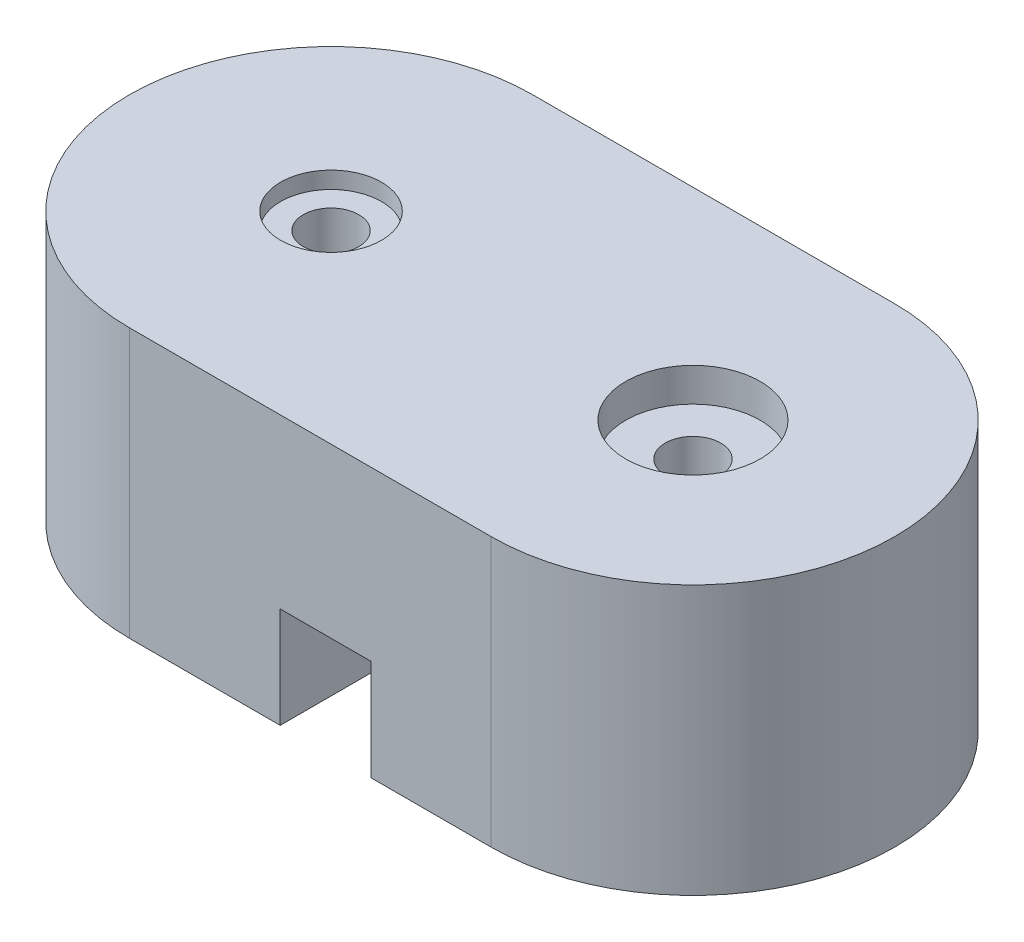
ISO-10303-21;
HEADER;
FILE_DESCRIPTION(('STEP AP214'),'2;1');
FILE_NAME('part.step','',(''),(''),'','','');
FILE_SCHEMA(('AUTOMOTIVE_DESIGN { 1 0 10303 214 1 1 1 1 }'));
ENDSEC;
DATA;
#1=APPLICATION_CONTEXT('core data for automotive mechanical design processes');
#2=APPLICATION_PROTOCOL_DEFINITION('international standard','automotive_design',2000,#1);
#3=PRODUCT_CONTEXT('',#1,'mechanical');
#4=PRODUCT('Part','Part','',(#3));
#5=PRODUCT_RELATED_PRODUCT_CATEGORY('part','',(#4));
#6=PRODUCT_DEFINITION_FORMATION('','',#4);
#7=PRODUCT_DEFINITION_CONTEXT('part definition',#1,'design');
#8=PRODUCT_DEFINITION('design','',#6,#7);
#9=PRODUCT_DEFINITION_SHAPE('','',#8);
#10=(LENGTH_UNIT() NAMED_UNIT(*) SI_UNIT(.MILLI.,.METRE.));
#11=(NAMED_UNIT(*) PLANE_ANGLE_UNIT() SI_UNIT($,.RADIAN.));
#12=(NAMED_UNIT(*) SI_UNIT($,.STERADIAN.) SOLID_ANGLE_UNIT());
#13=UNCERTAINTY_MEASURE_WITH_UNIT(LENGTH_MEASURE(1.E-05),#10,'distance_accuracy_value','');
#14=(GEOMETRIC_REPRESENTATION_CONTEXT(3) GLOBAL_UNCERTAINTY_ASSIGNED_CONTEXT((#13)) GLOBAL_UNIT_ASSIGNED_CONTEXT((#10,
#11,#12)) REPRESENTATION_CONTEXT('',''));
#15=CARTESIAN_POINT('',(0.,0.,0.));
#16=DIRECTION('',(0.,0.,1.));
#17=DIRECTION('',(1.,0.,0.));
#18=AXIS2_PLACEMENT_3D('',#15,#16,#17);
#19=CARTESIAN_POINT('',(-10.765,0.,0.));
#20=DIRECTION('',(0.,1.,0.));
#21=DIRECTION('',(0.,0.,1.));
#22=AXIS2_PLACEMENT_3D('',#19,#20,#21);
#23=CYLINDRICAL_SURFACE('',#22,1.65);
#24=CARTESIAN_POINT('',(-10.765,12.,0.));
#25=DIRECTION('',(0.,1.,0.));
#26=DIRECTION('',(0.,0.,1.));
#27=AXIS2_PLACEMENT_3D('',#24,#25,#26);
#28=CIRCLE('',#27,1.65);
#29=CARTESIAN_POINT('',(-10.765,12.,1.65));
#30=VERTEX_POINT('',#29);
#31=EDGE_CURVE('E175',#30,#30,#28,.T.);
#32=ORIENTED_EDGE('',*,*,#31,.T.);
#33=EDGE_LOOP('',(#32));
#34=FACE_BOUND('',#33,.T.);
#35=CARTESIAN_POINT('',(-10.765,8.3,0.));
#36=DIRECTION('',(0.,-1.,0.));
#37=DIRECTION('',(0.,0.,-1.));
#38=AXIS2_PLACEMENT_3D('',#35,#36,#37);
#39=CIRCLE('',#38,1.65);
#40=CARTESIAN_POINT('',(-10.765,8.3,-1.65));
#41=VERTEX_POINT('',#40);
#42=EDGE_CURVE('E43',#41,#41,#39,.F.);
#43=ORIENTED_EDGE('',*,*,#42,.F.);
#44=EDGE_LOOP('',(#43));
#45=FACE_BOUND('',#44,.T.);
#46=ADVANCED_FACE('F39',(#34,#45),#23,.F.);
#47=CARTESIAN_POINT('',(3.6,3.,-12.));
#48=DIRECTION('',(1.,0.,0.));
#49=DIRECTION('',(0.,0.,-1.));
#50=AXIS2_PLACEMENT_3D('',#47,#48,#49);
#51=PLANE('',#50);
#52=DIRECTION('',(0.,0.,1.));
#53=VECTOR('',#52,1.);
#54=CARTESIAN_POINT('',(3.6,3.,-12.));
#55=LINE('',#54,#53);
#56=CARTESIAN_POINT('',(3.6,3.,2.21647806215175));
#57=VERTEX_POINT('',#56);
#58=CARTESIAN_POINT('',(3.6,3.,12.));
#59=VERTEX_POINT('',#58);
#60=EDGE_CURVE('E200',#57,#59,#55,.T.);
#61=ORIENTED_EDGE('',*,*,#60,.F.);
#62=DIRECTION('',(0.,-1.,0.));
#63=VECTOR('',#62,1.);
#64=CARTESIAN_POINT('',(3.6,6.3,2.21647806215175));
#65=LINE('',#64,#63);
#66=CARTESIAN_POINT('',(3.6,-3.,2.21647806215175));
#67=VERTEX_POINT('',#66);
#68=EDGE_CURVE('E54',#57,#67,#65,.T.);
#69=ORIENTED_EDGE('',*,*,#68,.T.);
#70=DIRECTION('',(0.,0.,-1.));
#71=VECTOR('',#70,1.);
#72=CARTESIAN_POINT('',(3.6,-3.,12.));
#73=LINE('',#72,#71);
#74=CARTESIAN_POINT('',(3.6,-3.,12.));
#75=VERTEX_POINT('',#74);
#76=EDGE_CURVE('E144',#75,#67,#73,.T.);
#77=ORIENTED_EDGE('',*,*,#76,.F.);
#78=DIRECTION('',(0.,-1.,0.));
#79=VECTOR('',#78,1.);
#80=CARTESIAN_POINT('',(3.6,3.,12.));
#81=LINE('',#80,#79);
#82=EDGE_CURVE('E141',#59,#75,#81,.T.);
#83=ORIENTED_EDGE('',*,*,#82,.F.);
#84=EDGE_LOOP('',(#61,#69,#77,#83));
#85=FACE_BOUND('',#84,.T.);
#86=ADVANCED_FACE('F228',(#85),#51,.F.);
#87=CARTESIAN_POINT('',(10.765,0.,0.));
#88=DIRECTION('',(0.,1.,0.));
#89=DIRECTION('',(0.,0.,1.));
#90=AXIS2_PLACEMENT_3D('',#87,#88,#89);
#91=CYLINDRICAL_SURFACE('',#90,1.65);
#92=CARTESIAN_POINT('',(10.765,11.,0.));
#93=DIRECTION('',(0.,1.,0.));
#94=DIRECTION('',(0.,0.,1.));
#95=AXIS2_PLACEMENT_3D('',#92,#93,#94);
#96=CIRCLE('',#95,1.65);
#97=CARTESIAN_POINT('',(10.765,11.,1.65));
#98=VERTEX_POINT('',#97);
#99=EDGE_CURVE('E182',#98,#98,#96,.T.);
#100=ORIENTED_EDGE('',*,*,#99,.T.);
#101=EDGE_LOOP('',(#100));
#102=FACE_BOUND('',#101,.T.);
#103=CARTESIAN_POINT('',(10.765,6.3,0.));
#104=DIRECTION('',(0.,-1.,0.));
#105=DIRECTION('',(0.,0.,-1.));
#106=AXIS2_PLACEMENT_3D('',#103,#104,#105);
#107=CIRCLE('',#106,1.65);
#108=CARTESIAN_POINT('',(10.765,6.3,-1.65));
#109=VERTEX_POINT('',#108);
#110=EDGE_CURVE('E170',#109,#109,#107,.F.);
#111=ORIENTED_EDGE('',*,*,#110,.F.);
#112=EDGE_LOOP('',(#111));
#113=FACE_BOUND('',#112,.T.);
#114=ADVANCED_FACE('F226',(#102,#113),#91,.F.);
#115=CARTESIAN_POINT('',(-10.765,13.,0.));
#116=DIRECTION('',(0.,-1.,0.));
#117=DIRECTION('',(0.,0.,-1.));
#118=AXIS2_PLACEMENT_3D('',#115,#116,#117);
#119=CYLINDRICAL_SURFACE('',#118,12.);
#120=DIRECTION('',(0.,-1.,0.));
#121=VECTOR('',#120,1.);
#122=CARTESIAN_POINT('',(-10.765,13.,-12.));
#123=LINE('',#122,#121);
#124=CARTESIAN_POINT('',(-10.765,13.,-12.));
#125=VERTEX_POINT('',#124);
#126=CARTESIAN_POINT('',(-10.765,-3.,-12.));
#127=VERTEX_POINT('',#126);
#128=EDGE_CURVE('E217',#125,#127,#123,.T.);
#129=ORIENTED_EDGE('',*,*,#128,.T.);
#130=CARTESIAN_POINT('',(-10.765,-3.,0.));
#131=DIRECTION('',(0.,-1.,0.));
#132=DIRECTION('',(0.,0.,-1.));
#133=AXIS2_PLACEMENT_3D('',#130,#131,#132);
#134=CIRCLE('',#133,12.);
#135=CARTESIAN_POINT('',(-10.765,-3.,12.));
#136=VERTEX_POINT('',#135);
#137=EDGE_CURVE('E147',#136,#127,#134,.T.);
#138=ORIENTED_EDGE('',*,*,#137,.F.);
#139=DIRECTION('',(0.,-1.,0.));
#140=VECTOR('',#139,1.);
#141=CARTESIAN_POINT('',(-10.765,13.,12.));
#142=LINE('',#141,#140);
#143=CARTESIAN_POINT('',(-10.765,13.,12.));
#144=VERTEX_POINT('',#143);
#145=EDGE_CURVE('E48',#144,#136,#142,.T.);
#146=ORIENTED_EDGE('',*,*,#145,.F.);
#147=CARTESIAN_POINT('',(-10.765,13.,0.));
#148=DIRECTION('',(0.,1.,0.));
#149=DIRECTION('',(0.,0.,1.));
#150=AXIS2_PLACEMENT_3D('',#147,#148,#149);
#151=CIRCLE('',#150,12.);
#152=EDGE_CURVE('E206',#125,#144,#151,.T.);
#153=ORIENTED_EDGE('',*,*,#152,.F.);
#154=EDGE_LOOP('',(#129,#138,#146,#153));
#155=FACE_BOUND('',#154,.T.);
#156=ADVANCED_FACE('F41',(#155),#119,.T.);
#157=CARTESIAN_POINT('',(-10.765,13.,12.));
#158=DIRECTION('',(0.,0.,-1.));
#159=DIRECTION('',(-1.,0.,0.));
#160=AXIS2_PLACEMENT_3D('',#157,#158,#159);
#161=PLANE('',#160);
#162=DIRECTION('',(-1.,0.,0.));
#163=VECTOR('',#162,1.);
#164=CARTESIAN_POINT('',(0.,3.,12.));
#165=LINE('',#164,#163);
#166=CARTESIAN_POINT('',(-1.79,3.,12.));
#167=VERTEX_POINT('',#166);
#168=EDGE_CURVE('E191',#59,#167,#165,.T.);
#169=ORIENTED_EDGE('',*,*,#168,.F.);
#170=ORIENTED_EDGE('',*,*,#82,.T.);
#171=DIRECTION('',(-1.,0.,0.));
#172=VECTOR('',#171,1.);
#173=CARTESIAN_POINT('',(10.765,-3.,12.));
#174=LINE('',#173,#172);
#175=CARTESIAN_POINT('',(10.765,-3.,12.));
#176=VERTEX_POINT('',#175);
#177=EDGE_CURVE('E133',#176,#75,#174,.T.);
#178=ORIENTED_EDGE('',*,*,#177,.F.);
#179=DIRECTION('',(0.,-1.,0.));
#180=VECTOR('',#179,1.);
#181=CARTESIAN_POINT('',(10.765,13.,12.));
#182=LINE('',#181,#180);
#183=CARTESIAN_POINT('',(10.765,13.,12.));
#184=VERTEX_POINT('',#183);
#185=EDGE_CURVE('E118',#184,#176,#182,.T.);
#186=ORIENTED_EDGE('',*,*,#185,.F.);
#187=DIRECTION('',(1.,0.,0.));
#188=VECTOR('',#187,1.);
#189=CARTESIAN_POINT('',(-10.765,13.,12.));
#190=LINE('',#189,#188);
#191=EDGE_CURVE('E213',#144,#184,#190,.T.);
#192=ORIENTED_EDGE('',*,*,#191,.F.);
#193=ORIENTED_EDGE('',*,*,#145,.T.);
#194=DIRECTION('',(-1.,0.,0.));
#195=VECTOR('',#194,1.);
#196=CARTESIAN_POINT('',(-1.79,-3.,12.));
#197=LINE('',#196,#195);
#198=CARTESIAN_POINT('',(-1.79,-3.,12.));
#199=VERTEX_POINT('',#198);
#200=EDGE_CURVE('E161',#199,#136,#197,.T.);
#201=ORIENTED_EDGE('',*,*,#200,.F.);
#202=DIRECTION('',(0.,-1.,0.));
#203=VECTOR('',#202,1.);
#204=CARTESIAN_POINT('',(-1.79,3.,12.));
#205=LINE('',#204,#203);
#206=EDGE_CURVE('E204',#167,#199,#205,.T.);
#207=ORIENTED_EDGE('',*,*,#206,.F.);
#208=EDGE_LOOP('',(#169,#170,#178,#186,#192,#193,#201,#207));
#209=FACE_BOUND('',#208,.T.);
#210=ADVANCED_FACE('F139',(#209),#161,.F.);
#211=CARTESIAN_POINT('',(10.765,13.,0.));
#212=DIRECTION('',(0.,-1.,0.));
#213=DIRECTION('',(0.,0.,-1.));
#214=AXIS2_PLACEMENT_3D('',#211,#212,#213);
#215=CYLINDRICAL_SURFACE('',#214,12.);
#216=ORIENTED_EDGE('',*,*,#185,.T.);
#217=CARTESIAN_POINT('',(10.765,-3.,0.));
#218=DIRECTION('',(0.,-1.,0.));
#219=DIRECTION('',(0.,0.,-1.));
#220=AXIS2_PLACEMENT_3D('',#217,#218,#219);
#221=CIRCLE('',#220,12.);
#222=CARTESIAN_POINT('',(10.765,-3.,-12.));
#223=VERTEX_POINT('',#222);
#224=EDGE_CURVE('E122',#223,#176,#221,.T.);
#225=ORIENTED_EDGE('',*,*,#224,.F.);
#226=DIRECTION('',(0.,-1.,0.));
#227=VECTOR('',#226,1.);
#228=CARTESIAN_POINT('',(10.765,13.,-12.));
#229=LINE('',#228,#227);
#230=CARTESIAN_POINT('',(10.765,13.,-12.));
#231=VERTEX_POINT('',#230);
#232=EDGE_CURVE('E126',#231,#223,#229,.T.);
#233=ORIENTED_EDGE('',*,*,#232,.F.);
#234=CARTESIAN_POINT('',(10.765,13.,0.));
#235=DIRECTION('',(0.,1.,0.));
#236=DIRECTION('',(0.,0.,1.));
#237=AXIS2_PLACEMENT_3D('',#234,#235,#236);
#238=CIRCLE('',#237,12.);
#239=EDGE_CURVE('E123',#184,#231,#238,.T.);
#240=ORIENTED_EDGE('',*,*,#239,.F.);
#241=EDGE_LOOP('',(#216,#225,#233,#240));
#242=FACE_BOUND('',#241,.T.);
#243=ADVANCED_FACE('F120',(#242),#215,.T.);
#244=CARTESIAN_POINT('',(-10.765,13.,-12.));
#245=DIRECTION('',(0.,0.,1.));
#246=DIRECTION('',(1.,0.,0.));
#247=AXIS2_PLACEMENT_3D('',#244,#245,#246);
#248=PLANE('',#247);
#249=ORIENTED_EDGE('',*,*,#232,.T.);
#250=DIRECTION('',(1.,0.,0.));
#251=VECTOR('',#250,1.);
#252=CARTESIAN_POINT('',(3.6,-3.,-12.));
#253=LINE('',#252,#251);
#254=CARTESIAN_POINT('',(3.6,-3.,-12.));
#255=VERTEX_POINT('',#254);
#256=EDGE_CURVE('E136',#255,#223,#253,.T.);
#257=ORIENTED_EDGE('',*,*,#256,.F.);
#258=DIRECTION('',(0.,-1.,0.));
#259=VECTOR('',#258,1.);
#260=CARTESIAN_POINT('',(3.6,3.,-12.));
#261=LINE('',#260,#259);
#262=CARTESIAN_POINT('',(3.6,3.,-12.));
#263=VERTEX_POINT('',#262);
#264=EDGE_CURVE('E207',#263,#255,#261,.T.);
#265=ORIENTED_EDGE('',*,*,#264,.F.);
#266=DIRECTION('',(1.,0.,0.));
#267=VECTOR('',#266,1.);
#268=CARTESIAN_POINT('',(-1.79,3.,-12.));
#269=LINE('',#268,#267);
#270=CARTESIAN_POINT('',(-1.79,3.,-12.));
#271=VERTEX_POINT('',#270);
#272=EDGE_CURVE('E198',#271,#263,#269,.T.);
#273=ORIENTED_EDGE('',*,*,#272,.F.);
#274=DIRECTION('',(0.,-1.,0.));
#275=VECTOR('',#274,1.);
#276=CARTESIAN_POINT('',(-1.79,3.,-12.));
#277=LINE('',#276,#275);
#278=CARTESIAN_POINT('',(-1.79,-3.,-12.));
#279=VERTEX_POINT('',#278);
#280=EDGE_CURVE('E209',#271,#279,#277,.T.);
#281=ORIENTED_EDGE('',*,*,#280,.T.);
#282=DIRECTION('',(1.,0.,0.));
#283=VECTOR('',#282,1.);
#284=CARTESIAN_POINT('',(-10.765,-3.,-12.));
#285=LINE('',#284,#283);
#286=EDGE_CURVE('E155',#127,#279,#285,.T.);
#287=ORIENTED_EDGE('',*,*,#286,.F.);
#288=ORIENTED_EDGE('',*,*,#128,.F.);
#289=DIRECTION('',(-1.,0.,0.));
#290=VECTOR('',#289,1.);
#291=CARTESIAN_POINT('',(-10.765,13.,-12.));
#292=LINE('',#291,#290);
#293=EDGE_CURVE('E62',#231,#125,#292,.T.);
#294=ORIENTED_EDGE('',*,*,#293,.F.);
#295=EDGE_LOOP('',(#249,#257,#265,#273,#281,#287,#288,#294));
#296=FACE_BOUND('',#295,.T.);
#297=ADVANCED_FACE('F270',(#296),#248,.F.);
#298=CARTESIAN_POINT('',(-10.765,13.,0.));
#299=DIRECTION('',(0.,1.,0.));
#300=DIRECTION('',(0.,0.,1.));
#301=AXIS2_PLACEMENT_3D('',#298,#299,#300);
#302=PLANE('',#301);
#303=CARTESIAN_POINT('',(-10.765,13.,0.));
#304=DIRECTION('',(0.,1.,0.));
#305=DIRECTION('',(0.,0.,1.));
#306=AXIS2_PLACEMENT_3D('',#303,#304,#305);
#307=CIRCLE('',#306,3.);
#308=CARTESIAN_POINT('',(-10.765,13.,3.));
#309=VERTEX_POINT('',#308);
#310=EDGE_CURVE('E178',#309,#309,#307,.T.);
#311=ORIENTED_EDGE('',*,*,#310,.F.);
#312=EDGE_LOOP('',(#311));
#313=FACE_BOUND('',#312,.T.);
#314=CARTESIAN_POINT('',(10.765,13.,0.));
#315=DIRECTION('',(0.,1.,0.));
#316=DIRECTION('',(0.,0.,1.));
#317=AXIS2_PLACEMENT_3D('',#314,#315,#316);
#318=CIRCLE('',#317,4.);
#319=CARTESIAN_POINT('',(10.765,13.,4.));
#320=VERTEX_POINT('',#319);
#321=EDGE_CURVE('E187',#320,#320,#318,.T.);
#322=ORIENTED_EDGE('',*,*,#321,.F.);
#323=EDGE_LOOP('',(#322));
#324=FACE_BOUND('',#323,.T.);
#325=ORIENTED_EDGE('',*,*,#152,.T.);
#326=ORIENTED_EDGE('',*,*,#191,.T.);
#327=ORIENTED_EDGE('',*,*,#239,.T.);
#328=ORIENTED_EDGE('',*,*,#293,.T.);
#329=EDGE_LOOP('',(#325,#326,#327,#328));
#330=FACE_BOUND('',#329,.T.);
#331=ADVANCED_FACE('F267',(#313,#324,#330),#302,.T.);
#332=ORIENTED_EDGE('',*,*,#264,.T.);
#333=DIRECTION('',(0.,0.,-1.));
#334=VECTOR('',#333,1.);
#335=CARTESIAN_POINT('',(3.6,-3.,-2.21647806215175));
#336=LINE('',#335,#334);
#337=CARTESIAN_POINT('',(3.6,-3.,-2.21647806215175));
#338=VERTEX_POINT('',#337);
#339=EDGE_CURVE('E292',#338,#255,#336,.T.);
#340=ORIENTED_EDGE('',*,*,#339,.F.);
#341=DIRECTION('',(0.,-1.,0.));
#342=VECTOR('',#341,1.);
#343=CARTESIAN_POINT('',(3.6,6.3,-2.21647806215175));
#344=LINE('',#343,#342);
#345=CARTESIAN_POINT('',(3.6,3.,-2.21647806215175));
#346=VERTEX_POINT('',#345);
#347=EDGE_CURVE('E171',#338,#346,#344,.F.);
#348=ORIENTED_EDGE('',*,*,#347,.T.);
#349=EDGE_CURVE('E201',#263,#346,#55,.T.);
#350=ORIENTED_EDGE('',*,*,#349,.F.);
#351=EDGE_LOOP('',(#332,#340,#348,#350));
#352=FACE_BOUND('',#351,.T.);
#353=ADVANCED_FACE('F238',(#352),#51,.F.);
#354=CARTESIAN_POINT('',(-1.79,3.,12.));
#355=DIRECTION('',(-1.,0.,0.));
#356=DIRECTION('',(0.,0.,1.));
#357=AXIS2_PLACEMENT_3D('',#354,#355,#356);
#358=PLANE('',#357);
#359=ORIENTED_EDGE('',*,*,#206,.T.);
#360=DIRECTION('',(0.,0.,1.));
#361=VECTOR('',#360,1.);
#362=CARTESIAN_POINT('',(-1.79,-3.,-12.));
#363=LINE('',#362,#361);
#364=EDGE_CURVE('E158',#279,#199,#363,.T.);
#365=ORIENTED_EDGE('',*,*,#364,.F.);
#366=ORIENTED_EDGE('',*,*,#280,.F.);
#367=DIRECTION('',(0.,0.,-1.));
#368=VECTOR('',#367,1.);
#369=CARTESIAN_POINT('',(-1.79,3.,12.));
#370=LINE('',#369,#368);
#371=EDGE_CURVE('E195',#167,#271,#370,.T.);
#372=ORIENTED_EDGE('',*,*,#371,.F.);
#373=EDGE_LOOP('',(#359,#365,#366,#372));
#374=FACE_BOUND('',#373,.T.);
#375=ADVANCED_FACE('F284',(#374),#358,.F.);
#376=CARTESIAN_POINT('',(0.,3.,0.));
#377=DIRECTION('',(0.,-1.,0.));
#378=DIRECTION('',(0.,0.,-1.));
#379=AXIS2_PLACEMENT_3D('',#376,#377,#378);
#380=PLANE('',#379);
#381=CARTESIAN_POINT('',(10.765,3.,0.));
#382=DIRECTION('',(0.,-1.,0.));
#383=DIRECTION('',(0.,0.,-1.));
#384=AXIS2_PLACEMENT_3D('',#381,#382,#383);
#385=CIRCLE('',#384,7.5);
#386=EDGE_CURVE('E11',#57,#346,#385,.T.);
#387=ORIENTED_EDGE('',*,*,#386,.F.);
#388=ORIENTED_EDGE('',*,*,#60,.T.);
#389=ORIENTED_EDGE('',*,*,#168,.T.);
#390=ORIENTED_EDGE('',*,*,#371,.T.);
#391=ORIENTED_EDGE('',*,*,#272,.T.);
#392=ORIENTED_EDGE('',*,*,#349,.T.);
#393=EDGE_LOOP('',(#387,#388,#389,#390,#391,#392));
#394=FACE_BOUND('',#393,.T.);
#395=ADVANCED_FACE('F287',(#394),#380,.T.);
#396=CARTESIAN_POINT('',(10.765,11.,0.));
#397=DIRECTION('',(0.,1.,0.));
#398=DIRECTION('',(0.,0.,1.));
#399=AXIS2_PLACEMENT_3D('',#396,#397,#398);
#400=CYLINDRICAL_SURFACE('',#399,4.);
#401=CARTESIAN_POINT('',(10.765,11.,0.));
#402=DIRECTION('',(0.,1.,0.));
#403=DIRECTION('',(0.,0.,1.));
#404=AXIS2_PLACEMENT_3D('',#401,#402,#403);
#405=CIRCLE('',#404,4.);
#406=CARTESIAN_POINT('',(10.765,11.,4.));
#407=VERTEX_POINT('',#406);
#408=EDGE_CURVE('E188',#407,#407,#405,.T.);
#409=ORIENTED_EDGE('',*,*,#408,.F.);
#410=EDGE_LOOP('',(#409));
#411=FACE_BOUND('',#410,.T.);
#412=ORIENTED_EDGE('',*,*,#321,.T.);
#413=EDGE_LOOP('',(#412));
#414=FACE_BOUND('',#413,.T.);
#415=ADVANCED_FACE('F261',(#411,#414),#400,.F.);
#416=CARTESIAN_POINT('',(10.765,11.,0.));
#417=DIRECTION('',(0.,1.,0.));
#418=DIRECTION('',(0.,0.,1.));
#419=AXIS2_PLACEMENT_3D('',#416,#417,#418);
#420=PLANE('',#419);
#421=ORIENTED_EDGE('',*,*,#99,.F.);
#422=EDGE_LOOP('',(#421));
#423=FACE_BOUND('',#422,.T.);
#424=ORIENTED_EDGE('',*,*,#408,.T.);
#425=EDGE_LOOP('',(#424));
#426=FACE_BOUND('',#425,.T.);
#427=ADVANCED_FACE('F256',(#423,#426),#420,.T.);
#428=CARTESIAN_POINT('',(-10.765,12.,0.));
#429=DIRECTION('',(0.,1.,0.));
#430=DIRECTION('',(0.,0.,1.));
#431=AXIS2_PLACEMENT_3D('',#428,#429,#430);
#432=CYLINDRICAL_SURFACE('',#431,3.);
#433=CARTESIAN_POINT('',(-10.765,12.,0.));
#434=DIRECTION('',(0.,1.,0.));
#435=DIRECTION('',(0.,0.,1.));
#436=AXIS2_PLACEMENT_3D('',#433,#434,#435);
#437=CIRCLE('',#436,3.);
#438=CARTESIAN_POINT('',(-10.765,12.,3.));
#439=VERTEX_POINT('',#438);
#440=EDGE_CURVE('E179',#439,#439,#437,.T.);
#441=ORIENTED_EDGE('',*,*,#440,.F.);
#442=EDGE_LOOP('',(#441));
#443=FACE_BOUND('',#442,.T.);
#444=ORIENTED_EDGE('',*,*,#310,.T.);
#445=EDGE_LOOP('',(#444));
#446=FACE_BOUND('',#445,.T.);
#447=ADVANCED_FACE('F253',(#443,#446),#432,.F.);
#448=CARTESIAN_POINT('',(-10.765,12.,0.));
#449=DIRECTION('',(0.,1.,0.));
#450=DIRECTION('',(0.,0.,1.));
#451=AXIS2_PLACEMENT_3D('',#448,#449,#450);
#452=PLANE('',#451);
#453=ORIENTED_EDGE('',*,*,#31,.F.);
#454=EDGE_LOOP('',(#453));
#455=FACE_BOUND('',#454,.T.);
#456=ORIENTED_EDGE('',*,*,#440,.T.);
#457=EDGE_LOOP('',(#456));
#458=FACE_BOUND('',#457,.T.);
#459=ADVANCED_FACE('F251',(#455,#458),#452,.T.);
#460=CARTESIAN_POINT('',(10.765,6.3,0.));
#461=DIRECTION('',(0.,-1.,0.));
#462=DIRECTION('',(0.,0.,-1.));
#463=AXIS2_PLACEMENT_3D('',#460,#461,#462);
#464=CYLINDRICAL_SURFACE('',#463,7.5);
#465=CARTESIAN_POINT('',(10.765,6.3,0.));
#466=DIRECTION('',(0.,-1.,0.));
#467=DIRECTION('',(0.,0.,-1.));
#468=AXIS2_PLACEMENT_3D('',#465,#466,#467);
#469=CIRCLE('',#468,7.5);
#470=CARTESIAN_POINT('',(10.765,6.3,-7.5));
#471=VERTEX_POINT('',#470);
#472=EDGE_CURVE('E167',#471,#471,#469,.T.);
#473=ORIENTED_EDGE('',*,*,#472,.F.);
#474=EDGE_LOOP('',(#473));
#475=FACE_BOUND('',#474,.T.);
#476=ORIENTED_EDGE('',*,*,#386,.T.);
#477=ORIENTED_EDGE('',*,*,#347,.F.);
#478=CARTESIAN_POINT('',(10.765,-3.,0.));
#479=DIRECTION('',(0.,1.,0.));
#480=DIRECTION('',(0.,0.,-1.));
#481=AXIS2_PLACEMENT_3D('',#478,#479,#480);
#482=CIRCLE('',#481,7.5);
#483=EDGE_CURVE('E149',#67,#338,#482,.T.);
#484=ORIENTED_EDGE('',*,*,#483,.F.);
#485=ORIENTED_EDGE('',*,*,#68,.F.);
#486=EDGE_LOOP('',(#476,#477,#484,#485));
#487=FACE_BOUND('',#486,.T.);
#488=ADVANCED_FACE('F249',(#475,#487),#464,.F.);
#489=CARTESIAN_POINT('',(10.765,6.3,0.));
#490=DIRECTION('',(0.,-1.,0.));
#491=DIRECTION('',(0.,0.,-1.));
#492=AXIS2_PLACEMENT_3D('',#489,#490,#491);
#493=PLANE('',#492);
#494=ORIENTED_EDGE('',*,*,#472,.T.);
#495=EDGE_LOOP('',(#494));
#496=FACE_BOUND('',#495,.T.);
#497=ORIENTED_EDGE('',*,*,#110,.T.);
#498=EDGE_LOOP('',(#497));
#499=FACE_BOUND('',#498,.T.);
#500=ADVANCED_FACE('F224',(#496,#499),#493,.T.);
#501=CARTESIAN_POINT('',(-10.765,8.3,0.));
#502=DIRECTION('',(0.,-1.,0.));
#503=DIRECTION('',(0.,0.,-1.));
#504=AXIS2_PLACEMENT_3D('',#501,#502,#503);
#505=PLANE('',#504);
#506=CARTESIAN_POINT('',(-10.765,8.3,0.));
#507=DIRECTION('',(0.,-1.,0.));
#508=DIRECTION('',(0.,0.,-1.));
#509=AXIS2_PLACEMENT_3D('',#506,#507,#508);
#510=CIRCLE('',#509,5.);
#511=CARTESIAN_POINT('',(-10.765,8.3,-5.));
#512=VERTEX_POINT('',#511);
#513=EDGE_CURVE('E164',#512,#512,#510,.T.);
#514=ORIENTED_EDGE('',*,*,#513,.T.);
#515=EDGE_LOOP('',(#514));
#516=FACE_BOUND('',#515,.T.);
#517=ORIENTED_EDGE('',*,*,#42,.T.);
#518=EDGE_LOOP('',(#517));
#519=FACE_BOUND('',#518,.T.);
#520=ADVANCED_FACE('F371',(#516,#519),#505,.T.);
#521=CARTESIAN_POINT('',(-10.765,8.3,0.));
#522=DIRECTION('',(0.,-1.,0.));
#523=DIRECTION('',(0.,0.,-1.));
#524=AXIS2_PLACEMENT_3D('',#521,#522,#523);
#525=CYLINDRICAL_SURFACE('',#524,5.);
#526=CARTESIAN_POINT('',(-10.765,-3.,0.));
#527=DIRECTION('',(0.,-1.,0.));
#528=DIRECTION('',(0.,0.,-1.));
#529=AXIS2_PLACEMENT_3D('',#526,#527,#528);
#530=CIRCLE('',#529,5.);
#531=CARTESIAN_POINT('',(-10.765,-3.,-5.));
#532=VERTEX_POINT('',#531);
#533=EDGE_CURVE('E143',#532,#532,#530,.T.);
#534=CARTESIAN_POINT('',(-10.765,8.3,-5.));
#535=CARTESIAN_POINT('',(-10.765,8.18229166666667,-5.));
#536=CARTESIAN_POINT('',(-10.765,8.06458333333333,-5.));
#537=CARTESIAN_POINT('',(-10.765,7.82916666666667,-5.));
#538=CARTESIAN_POINT('',(-10.765,7.71145833333333,-5.));
#539=CARTESIAN_POINT('',(-10.765,7.47604166666667,-5.));
#540=CARTESIAN_POINT('',(-10.765,7.35833333333333,-5.));
#541=CARTESIAN_POINT('',(-10.765,7.12291666666667,-5.));
#542=CARTESIAN_POINT('',(-10.765,7.00520833333333,-5.));
#543=CARTESIAN_POINT('',(-10.765,6.76979166666667,-5.));
#544=CARTESIAN_POINT('',(-10.765,6.65208333333333,-5.));
#545=CARTESIAN_POINT('',(-10.765,6.41666666666667,-5.));
#546=CARTESIAN_POINT('',(-10.765,6.29895833333333,-5.));
#547=CARTESIAN_POINT('',(-10.765,6.06354166666667,-5.));
#548=CARTESIAN_POINT('',(-10.765,5.94583333333333,-5.));
#549=CARTESIAN_POINT('',(-10.765,5.71041666666667,-5.));
#550=CARTESIAN_POINT('',(-10.765,5.59270833333333,-5.));
#551=CARTESIAN_POINT('',(-10.765,5.35729166666667,-5.));
#552=CARTESIAN_POINT('',(-10.765,5.23958333333333,-5.));
#553=CARTESIAN_POINT('',(-10.765,5.00416666666667,-5.));
#554=CARTESIAN_POINT('',(-10.765,4.88645833333333,-5.));
#555=CARTESIAN_POINT('',(-10.765,4.65104166666667,-5.));
#556=CARTESIAN_POINT('',(-10.765,4.53333333333333,-5.));
#557=CARTESIAN_POINT('',(-10.765,4.29791666666667,-5.));
#558=CARTESIAN_POINT('',(-10.765,4.18020833333333,-5.));
#559=CARTESIAN_POINT('',(-10.765,3.94479166666667,-5.));
#560=CARTESIAN_POINT('',(-10.765,3.82708333333333,-5.));
#561=CARTESIAN_POINT('',(-10.765,3.59166666666667,-5.));
#562=CARTESIAN_POINT('',(-10.765,3.47395833333333,-5.));
#563=CARTESIAN_POINT('',(-10.765,3.23854166666667,-5.));
#564=CARTESIAN_POINT('',(-10.765,3.12083333333333,-5.));
#565=CARTESIAN_POINT('',(-10.765,2.88541666666667,-5.));
#566=CARTESIAN_POINT('',(-10.765,2.76770833333333,-5.));
#567=CARTESIAN_POINT('',(-10.765,2.53229166666667,-5.));
#568=CARTESIAN_POINT('',(-10.765,2.41458333333333,-5.));
#569=CARTESIAN_POINT('',(-10.765,2.17916666666667,-5.));
#570=CARTESIAN_POINT('',(-10.765,2.06145833333333,-5.));
#571=CARTESIAN_POINT('',(-10.765,1.82604166666667,-5.));
#572=CARTESIAN_POINT('',(-10.765,1.70833333333333,-5.));
#573=CARTESIAN_POINT('',(-10.765,1.47291666666667,-5.));
#574=CARTESIAN_POINT('',(-10.765,1.35520833333333,-5.));
#575=CARTESIAN_POINT('',(-10.765,1.11979166666667,-5.));
#576=CARTESIAN_POINT('',(-10.765,1.00208333333333,-5.));
#577=CARTESIAN_POINT('',(-10.765,0.766666666666666,-5.));
#578=CARTESIAN_POINT('',(-10.765,0.648958333333333,-5.));
#579=CARTESIAN_POINT('',(-10.765,0.413541666666667,-5.));
#580=CARTESIAN_POINT('',(-10.765,0.295833333333334,-5.));
#581=CARTESIAN_POINT('',(-10.765,0.0604166666666681,-5.));
#582=CARTESIAN_POINT('',(-10.765,-0.057291666666665,-5.));
#583=CARTESIAN_POINT('',(-10.765,-0.292708333333332,-5.));
#584=CARTESIAN_POINT('',(-10.765,-0.410416666666665,-5.));
#585=CARTESIAN_POINT('',(-10.765,-0.645833333333332,-5.));
#586=CARTESIAN_POINT('',(-10.765,-0.763541666666665,-5.));
#587=CARTESIAN_POINT('',(-10.765,-0.998958333333332,-5.));
#588=CARTESIAN_POINT('',(-10.765,-1.11666666666667,-5.));
#589=CARTESIAN_POINT('',(-10.765,-1.35208333333333,-5.));
#590=CARTESIAN_POINT('',(-10.765,-1.46979166666667,-5.));
#591=CARTESIAN_POINT('',(-10.765,-1.70520833333333,-5.));
#592=CARTESIAN_POINT('',(-10.765,-1.82291666666667,-5.));
#593=CARTESIAN_POINT('',(-10.765,-2.05833333333333,-5.));
#594=CARTESIAN_POINT('',(-10.765,-2.17604166666667,-5.));
#595=CARTESIAN_POINT('',(-10.765,-2.41145833333333,-5.));
#596=CARTESIAN_POINT('',(-10.765,-2.52916666666667,-5.));
#597=CARTESIAN_POINT('',(-10.765,-2.76458333333333,-5.));
#598=CARTESIAN_POINT('',(-10.765,-2.88229166666667,-5.));
#599=CARTESIAN_POINT('',(-10.765,-3.,-5.));
#600=B_SPLINE_CURVE_WITH_KNOTS('',3,(#534,#535,#536,#537,#538,#539,#540,#541,#542,#543,#544,
#545,#546,#547,#548,#549,#550,#551,#552,#553,#554,#555,#556,#557,#558,#559,#560,#561,#562,#563,
#564,#565,#566,#567,#568,#569,#570,#571,#572,#573,#574,#575,#576,#577,#578,#579,#580,#581,#582,
#583,#584,#585,#586,#587,#588,#589,#590,#591,#592,#593,#594,#595,#596,#597,#598,#599),
.UNSPECIFIED.,.F.,.F.,(4,2,2,2,2,2,2,2,2,2,2,2,2,2,2,2,2,2,2,2,2,2,2,2,2,2,2,2,2,2,2,2,4),(0.,
0.353125000000001,0.706250000000001,1.059375,1.4125,1.765625,2.11875,2.471875,2.825,3.178125,
3.53125,3.884375,4.2375,4.590625,4.94375,5.296875,5.65,6.003125,6.35625,6.709375,7.0625,
7.415625,7.76875,8.121875,8.475,8.828125,9.18125,9.534375,9.8875,10.240625,10.59375,10.946875,
11.3),.UNSPECIFIED.);
#601=EDGE_CURVE('BSEAM388',#512,#532,#600,.T.);
#602=ORIENTED_EDGE('',*,*,#513,.F.);
#603=ORIENTED_EDGE('',*,*,#533,.T.);
#604=ORIENTED_EDGE('',*,*,#601,.T.);
#605=ORIENTED_EDGE('',*,*,#601,.F.);
#606=EDGE_LOOP('',(#602,#604,#603,#605));
#607=FACE_BOUND('',#606,.T.);
#608=ADVANCED_FACE('F388',(#607),#525,.F.);
#609=CARTESIAN_POINT('',(-10.765,-3.,0.));
#610=DIRECTION('',(0.,-1.,0.));
#611=DIRECTION('',(0.,0.,-1.));
#612=AXIS2_PLACEMENT_3D('',#609,#610,#611);
#613=PLANE('',#612);
#614=ORIENTED_EDGE('',*,*,#137,.T.);
#615=ORIENTED_EDGE('',*,*,#286,.T.);
#616=ORIENTED_EDGE('',*,*,#364,.T.);
#617=ORIENTED_EDGE('',*,*,#200,.T.);
#618=EDGE_LOOP('',(#614,#615,#616,#617));
#619=FACE_BOUND('',#618,.T.);
#620=ORIENTED_EDGE('',*,*,#533,.F.);
#621=EDGE_LOOP('',(#620));
#622=FACE_BOUND('',#621,.T.);
#623=ADVANCED_FACE('F279',(#619,#622),#613,.T.);
#624=CARTESIAN_POINT('',(10.765,-3.,0.));
#625=DIRECTION('',(0.,-1.,0.));
#626=DIRECTION('',(0.,0.,-1.));
#627=AXIS2_PLACEMENT_3D('',#624,#625,#626);
#628=PLANE('',#627);
#629=ORIENTED_EDGE('',*,*,#177,.T.);
#630=ORIENTED_EDGE('',*,*,#76,.T.);
#631=ORIENTED_EDGE('',*,*,#483,.T.);
#632=ORIENTED_EDGE('',*,*,#339,.T.);
#633=ORIENTED_EDGE('',*,*,#256,.T.);
#634=ORIENTED_EDGE('',*,*,#224,.T.);
#635=EDGE_LOOP('',(#629,#630,#631,#632,#633,#634));
#636=FACE_BOUND('',#635,.T.);
#637=ADVANCED_FACE('F131',(#636),#628,.T.);
#638=CLOSED_SHELL('',(#46,#86,#114,#156,#210,#243,#297,#331,#353,#375,#395,#415,#427,#447,#459,
#488,#500,#520,#608,#623,#637));
#639=MANIFOLD_SOLID_BREP('B2',#638);
#640=ADVANCED_BREP_SHAPE_REPRESENTATION('',(#18,#639),#14);
#641=SHAPE_DEFINITION_REPRESENTATION(#9,#640);
ENDSEC;
END-ISO-10303-21;
